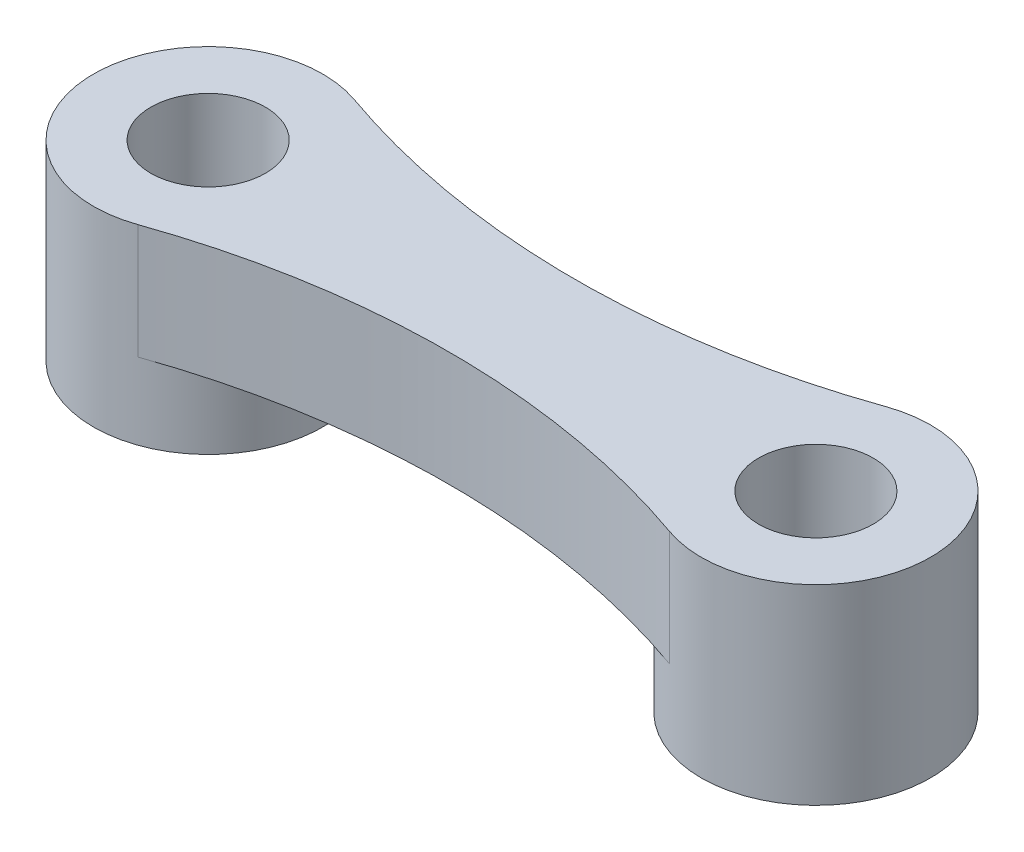
ISO-10303-21;
HEADER;
FILE_DESCRIPTION(('STEP AP214'),'2;1');
FILE_NAME('part.step','',(''),(''),'','','');
FILE_SCHEMA(('AUTOMOTIVE_DESIGN { 1 0 10303 214 1 1 1 1 }'));
ENDSEC;
DATA;
#1=APPLICATION_CONTEXT('core data for automotive mechanical design processes');
#2=APPLICATION_PROTOCOL_DEFINITION('international standard','automotive_design',2000,#1);
#3=PRODUCT_CONTEXT('',#1,'mechanical');
#4=PRODUCT('Part','Part','',(#3));
#5=PRODUCT_RELATED_PRODUCT_CATEGORY('part','',(#4));
#6=PRODUCT_DEFINITION_FORMATION('','',#4);
#7=PRODUCT_DEFINITION_CONTEXT('part definition',#1,'design');
#8=PRODUCT_DEFINITION('design','',#6,#7);
#9=PRODUCT_DEFINITION_SHAPE('','',#8);
#10=(LENGTH_UNIT() NAMED_UNIT(*) SI_UNIT(.MILLI.,.METRE.));
#11=(NAMED_UNIT(*) PLANE_ANGLE_UNIT() SI_UNIT($,.RADIAN.));
#12=(NAMED_UNIT(*) SI_UNIT($,.STERADIAN.) SOLID_ANGLE_UNIT());
#13=UNCERTAINTY_MEASURE_WITH_UNIT(LENGTH_MEASURE(1.E-05),#10,'distance_accuracy_value','');
#14=(GEOMETRIC_REPRESENTATION_CONTEXT(3) GLOBAL_UNCERTAINTY_ASSIGNED_CONTEXT((#13)) GLOBAL_UNIT_ASSIGNED_CONTEXT((#10,
#11,#12)) REPRESENTATION_CONTEXT('',''));
#15=CARTESIAN_POINT('',(0.,0.,0.));
#16=DIRECTION('',(0.,0.,1.));
#17=DIRECTION('',(1.,0.,0.));
#18=AXIS2_PLACEMENT_3D('',#15,#16,#17);
#19=CARTESIAN_POINT('',(-7.95,3.,0.));
#20=DIRECTION('',(0.,1.,0.));
#21=DIRECTION('',(0.,0.,1.));
#22=AXIS2_PLACEMENT_3D('',#19,#20,#21);
#23=PLANE('',#22);
#24=CARTESIAN_POINT('',(-7.95,3.,0.));
#25=DIRECTION('',(0.,1.,0.));
#26=DIRECTION('',(0.,0.,1.));
#27=AXIS2_PLACEMENT_3D('',#24,#25,#26);
#28=CIRCLE('',#27,1.5);
#29=CARTESIAN_POINT('',(-7.95,3.,1.5));
#30=VERTEX_POINT('',#29);
#31=EDGE_CURVE('E163',#30,#30,#28,.T.);
#32=ORIENTED_EDGE('',*,*,#31,.F.);
#33=EDGE_LOOP('',(#32));
#34=FACE_BOUND('',#33,.T.);
#35=CARTESIAN_POINT('',(7.95,3.,0.));
#36=DIRECTION('',(0.,1.,0.));
#37=DIRECTION('',(0.,0.,1.));
#38=AXIS2_PLACEMENT_3D('',#35,#36,#37);
#39=CIRCLE('',#38,1.5);
#40=CARTESIAN_POINT('',(7.95,3.,1.5));
#41=VERTEX_POINT('',#40);
#42=EDGE_CURVE('E158',#41,#41,#39,.T.);
#43=ORIENTED_EDGE('',*,*,#42,.F.);
#44=EDGE_LOOP('',(#43));
#45=FACE_BOUND('',#44,.T.);
#46=CARTESIAN_POINT('',(7.95,3.,0.));
#47=DIRECTION('',(0.,1.,0.));
#48=DIRECTION('',(0.,0.,1.));
#49=AXIS2_PLACEMENT_3D('',#46,#47,#48);
#50=CIRCLE('',#49,3.);
#51=CARTESIAN_POINT('',(6.95625,3.,2.83062907098404));
#52=VERTEX_POINT('',#51);
#53=CARTESIAN_POINT('',(6.95625000000001,3.,-2.83062907098404));
#54=VERTEX_POINT('',#53);
#55=EDGE_CURVE('E15',#52,#54,#50,.T.);
#56=ORIENTED_EDGE('',*,*,#55,.T.);
#57=CARTESIAN_POINT('',(0.,3.,-22.6450325678724));
#58=DIRECTION('',(0.,-1.,0.));
#59=DIRECTION('',(0.,0.,1.));
#60=AXIS2_PLACEMENT_3D('',#57,#58,#59);
#61=CIRCLE('',#60,21.);
#62=CARTESIAN_POINT('',(-6.95625,3.,-2.83062907098405));
#63=VERTEX_POINT('',#62);
#64=EDGE_CURVE('E153',#54,#63,#61,.T.);
#65=ORIENTED_EDGE('',*,*,#64,.T.);
#66=CARTESIAN_POINT('',(-7.95,3.,0.));
#67=DIRECTION('',(0.,1.,0.));
#68=DIRECTION('',(0.,0.,1.));
#69=AXIS2_PLACEMENT_3D('',#66,#67,#68);
#70=CIRCLE('',#69,3.);
#71=CARTESIAN_POINT('',(-6.95625,3.,2.83062907098405));
#72=VERTEX_POINT('',#71);
#73=EDGE_CURVE('E92',#63,#72,#70,.T.);
#74=ORIENTED_EDGE('',*,*,#73,.T.);
#75=CARTESIAN_POINT('',(0.,3.,22.6450325678724));
#76=DIRECTION('',(0.,-1.,0.));
#77=DIRECTION('',(0.,0.,-1.));
#78=AXIS2_PLACEMENT_3D('',#75,#76,#77);
#79=CIRCLE('',#78,21.);
#80=EDGE_CURVE('E149',#72,#52,#79,.T.);
#81=ORIENTED_EDGE('',*,*,#80,.T.);
#82=EDGE_LOOP('',(#56,#65,#74,#81));
#83=FACE_BOUND('',#82,.T.);
#84=ADVANCED_FACE('F84',(#34,#45,#83),#23,.T.);
#85=CARTESIAN_POINT('',(-7.95,0.,0.));
#86=DIRECTION('',(0.,1.,0.));
#87=DIRECTION('',(0.,0.,1.));
#88=AXIS2_PLACEMENT_3D('',#85,#86,#87);
#89=PLANE('',#88);
#90=CARTESIAN_POINT('',(0.,0.,-22.6450325678724));
#91=DIRECTION('',(0.,-1.,0.));
#92=DIRECTION('',(0.,0.,1.));
#93=AXIS2_PLACEMENT_3D('',#90,#91,#92);
#94=CIRCLE('',#93,21.);
#95=CARTESIAN_POINT('',(6.95625000000001,0.,-2.83062907098404));
#96=VERTEX_POINT('',#95);
#97=CARTESIAN_POINT('',(-6.95625,0.,-2.83062907098405));
#98=VERTEX_POINT('',#97);
#99=EDGE_CURVE('E128',#96,#98,#94,.T.);
#100=ORIENTED_EDGE('',*,*,#99,.F.);
#101=CARTESIAN_POINT('',(7.95,0.,0.));
#102=DIRECTION('',(0.,1.,0.));
#103=DIRECTION('',(0.,0.,1.));
#104=AXIS2_PLACEMENT_3D('',#101,#102,#103);
#105=CIRCLE('',#104,3.);
#106=CARTESIAN_POINT('',(6.95625,0.,2.83062907098405));
#107=VERTEX_POINT('',#106);
#108=EDGE_CURVE('E122',#96,#107,#105,.T.);
#109=ORIENTED_EDGE('',*,*,#108,.T.);
#110=CARTESIAN_POINT('',(0.,0.,22.6450325678724));
#111=DIRECTION('',(0.,-1.,0.));
#112=DIRECTION('',(0.,0.,-1.));
#113=AXIS2_PLACEMENT_3D('',#110,#111,#112);
#114=CIRCLE('',#113,21.);
#115=CARTESIAN_POINT('',(-6.95625,0.,2.83062907098405));
#116=VERTEX_POINT('',#115);
#117=EDGE_CURVE('E126',#116,#107,#114,.T.);
#118=ORIENTED_EDGE('',*,*,#117,.F.);
#119=CARTESIAN_POINT('',(-7.95,0.,0.));
#120=DIRECTION('',(0.,1.,0.));
#121=DIRECTION('',(0.,0.,1.));
#122=AXIS2_PLACEMENT_3D('',#119,#120,#121);
#123=CIRCLE('',#122,3.);
#124=EDGE_CURVE('E99',#116,#98,#123,.T.);
#125=ORIENTED_EDGE('',*,*,#124,.T.);
#126=EDGE_LOOP('',(#100,#109,#118,#125));
#127=FACE_BOUND('',#126,.T.);
#128=ADVANCED_FACE('F124',(#127),#89,.F.);
#129=CARTESIAN_POINT('',(-7.95,3.,0.));
#130=DIRECTION('',(0.,-1.,0.));
#131=DIRECTION('',(0.,0.,-1.));
#132=AXIS2_PLACEMENT_3D('',#129,#130,#131);
#133=CYLINDRICAL_SURFACE('',#132,3.);
#134=DIRECTION('',(0.,1.,0.));
#135=VECTOR('',#134,1.);
#136=CARTESIAN_POINT('',(-6.95625,0.,-2.83062907098405));
#137=LINE('',#136,#135);
#138=EDGE_CURVE('E146',#98,#63,#137,.T.);
#139=ORIENTED_EDGE('',*,*,#138,.F.);
#140=ORIENTED_EDGE('',*,*,#124,.F.);
#141=DIRECTION('',(0.,1.,0.));
#142=VECTOR('',#141,1.);
#143=CARTESIAN_POINT('',(-6.95625,0.,2.83062907098405));
#144=LINE('',#143,#142);
#145=EDGE_CURVE('E143',#116,#72,#144,.T.);
#146=ORIENTED_EDGE('',*,*,#145,.T.);
#147=ORIENTED_EDGE('',*,*,#73,.F.);
#148=EDGE_LOOP('',(#139,#140,#146,#147));
#149=FACE_BOUND('',#148,.T.);
#150=CARTESIAN_POINT('',(-7.95,-2.,0.));
#151=DIRECTION('',(0.,1.,0.));
#152=DIRECTION('',(0.,0.,1.));
#153=AXIS2_PLACEMENT_3D('',#150,#151,#152);
#154=CIRCLE('',#153,3.);
#155=CARTESIAN_POINT('',(-7.95,-2.,3.));
#156=VERTEX_POINT('',#155);
#157=EDGE_CURVE('E156',#156,#156,#154,.T.);
#158=ORIENTED_EDGE('',*,*,#157,.T.);
#159=EDGE_LOOP('',(#158));
#160=FACE_BOUND('',#159,.T.);
#161=ADVANCED_FACE('F86',(#149,#160),#133,.T.);
#162=CARTESIAN_POINT('',(7.95,3.,0.));
#163=DIRECTION('',(0.,-1.,0.));
#164=DIRECTION('',(0.,0.,-1.));
#165=AXIS2_PLACEMENT_3D('',#162,#163,#164);
#166=CYLINDRICAL_SURFACE('',#165,3.);
#167=DIRECTION('',(0.,1.,0.));
#168=VECTOR('',#167,1.);
#169=CARTESIAN_POINT('',(6.95625,0.,2.83062907098404));
#170=LINE('',#169,#168);
#171=EDGE_CURVE('E136',#107,#52,#170,.T.);
#172=ORIENTED_EDGE('',*,*,#171,.F.);
#173=ORIENTED_EDGE('',*,*,#108,.F.);
#174=DIRECTION('',(0.,1.,0.));
#175=VECTOR('',#174,1.);
#176=CARTESIAN_POINT('',(6.95625000000001,0.,-2.83062907098404));
#177=LINE('',#176,#175);
#178=EDGE_CURVE('E142',#96,#54,#177,.T.);
#179=ORIENTED_EDGE('',*,*,#178,.T.);
#180=ORIENTED_EDGE('',*,*,#55,.F.);
#181=EDGE_LOOP('',(#172,#173,#179,#180));
#182=FACE_BOUND('',#181,.T.);
#183=CARTESIAN_POINT('',(7.95,-2.,0.));
#184=DIRECTION('',(0.,1.,0.));
#185=DIRECTION('',(0.,0.,1.));
#186=AXIS2_PLACEMENT_3D('',#183,#184,#185);
#187=CIRCLE('',#186,3.);
#188=CARTESIAN_POINT('',(7.95,-2.,3.));
#189=VERTEX_POINT('',#188);
#190=EDGE_CURVE('E132',#189,#189,#187,.T.);
#191=ORIENTED_EDGE('',*,*,#190,.T.);
#192=EDGE_LOOP('',(#191));
#193=FACE_BOUND('',#192,.T.);
#194=ADVANCED_FACE('F137',(#182,#193),#166,.T.);
#195=CARTESIAN_POINT('',(-7.95,3.,0.));
#196=DIRECTION('',(0.,-1.,0.));
#197=DIRECTION('',(0.,0.,-1.));
#198=AXIS2_PLACEMENT_3D('',#195,#196,#197);
#199=CYLINDRICAL_SURFACE('',#198,1.5);
#200=ORIENTED_EDGE('',*,*,#31,.T.);
#201=EDGE_LOOP('',(#200));
#202=FACE_BOUND('',#201,.T.);
#203=CARTESIAN_POINT('',(-7.95,-2.,0.));
#204=DIRECTION('',(0.,1.,0.));
#205=DIRECTION('',(0.,0.,1.));
#206=AXIS2_PLACEMENT_3D('',#203,#204,#205);
#207=CIRCLE('',#206,1.5);
#208=CARTESIAN_POINT('',(-7.95,-2.,1.5));
#209=VERTEX_POINT('',#208);
#210=EDGE_CURVE('E173',#209,#209,#207,.T.);
#211=ORIENTED_EDGE('',*,*,#210,.F.);
#212=EDGE_LOOP('',(#211));
#213=FACE_BOUND('',#212,.T.);
#214=ADVANCED_FACE('F188',(#202,#213),#199,.F.);
#215=CARTESIAN_POINT('',(7.95,3.,0.));
#216=DIRECTION('',(0.,-1.,0.));
#217=DIRECTION('',(0.,0.,-1.));
#218=AXIS2_PLACEMENT_3D('',#215,#216,#217);
#219=CYLINDRICAL_SURFACE('',#218,1.5);
#220=ORIENTED_EDGE('',*,*,#42,.T.);
#221=EDGE_LOOP('',(#220));
#222=FACE_BOUND('',#221,.T.);
#223=CARTESIAN_POINT('',(7.95,-2.,0.));
#224=DIRECTION('',(0.,1.,0.));
#225=DIRECTION('',(0.,0.,1.));
#226=AXIS2_PLACEMENT_3D('',#223,#224,#225);
#227=CIRCLE('',#226,1.5);
#228=CARTESIAN_POINT('',(7.95,-2.,1.5));
#229=VERTEX_POINT('',#228);
#230=EDGE_CURVE('E133',#229,#229,#227,.T.);
#231=ORIENTED_EDGE('',*,*,#230,.F.);
#232=EDGE_LOOP('',(#231));
#233=FACE_BOUND('',#232,.T.);
#234=ADVANCED_FACE('F185',(#222,#233),#219,.F.);
#235=CARTESIAN_POINT('',(0.,0.,-22.6450325678724));
#236=DIRECTION('',(0.,1.,0.));
#237=DIRECTION('',(0.,0.,1.));
#238=AXIS2_PLACEMENT_3D('',#235,#236,#237);
#239=CYLINDRICAL_SURFACE('',#238,21.);
#240=ORIENTED_EDGE('',*,*,#64,.F.);
#241=ORIENTED_EDGE('',*,*,#178,.F.);
#242=ORIENTED_EDGE('',*,*,#99,.T.);
#243=ORIENTED_EDGE('',*,*,#138,.T.);
#244=EDGE_LOOP('',(#240,#241,#242,#243));
#245=FACE_BOUND('',#244,.T.);
#246=ADVANCED_FACE('F187',(#245),#239,.F.);
#247=CARTESIAN_POINT('',(0.,0.,22.6450325678724));
#248=DIRECTION('',(0.,1.,0.));
#249=DIRECTION('',(0.,0.,1.));
#250=AXIS2_PLACEMENT_3D('',#247,#248,#249);
#251=CYLINDRICAL_SURFACE('',#250,21.);
#252=ORIENTED_EDGE('',*,*,#80,.F.);
#253=ORIENTED_EDGE('',*,*,#145,.F.);
#254=ORIENTED_EDGE('',*,*,#117,.T.);
#255=ORIENTED_EDGE('',*,*,#171,.T.);
#256=EDGE_LOOP('',(#252,#253,#254,#255));
#257=FACE_BOUND('',#256,.T.);
#258=ADVANCED_FACE('F145',(#257),#251,.F.);
#259=CARTESIAN_POINT('',(-7.95,-2.,0.));
#260=DIRECTION('',(0.,1.,0.));
#261=DIRECTION('',(0.,0.,1.));
#262=AXIS2_PLACEMENT_3D('',#259,#260,#261);
#263=PLANE('',#262);
#264=ORIENTED_EDGE('',*,*,#210,.T.);
#265=EDGE_LOOP('',(#264));
#266=FACE_BOUND('',#265,.T.);
#267=ORIENTED_EDGE('',*,*,#157,.F.);
#268=EDGE_LOOP('',(#267));
#269=FACE_BOUND('',#268,.T.);
#270=ADVANCED_FACE('F240',(#266,#269),#263,.F.);
#271=CARTESIAN_POINT('',(7.95,-2.,0.));
#272=DIRECTION('',(0.,1.,0.));
#273=DIRECTION('',(0.,0.,1.));
#274=AXIS2_PLACEMENT_3D('',#271,#272,#273);
#275=PLANE('',#274);
#276=ORIENTED_EDGE('',*,*,#230,.T.);
#277=EDGE_LOOP('',(#276));
#278=FACE_BOUND('',#277,.T.);
#279=ORIENTED_EDGE('',*,*,#190,.F.);
#280=EDGE_LOOP('',(#279));
#281=FACE_BOUND('',#280,.T.);
#282=ADVANCED_FACE('F182',(#278,#281),#275,.F.);
#283=CLOSED_SHELL('',(#84,#128,#161,#194,#214,#234,#246,#258,#270,#282));
#284=MANIFOLD_SOLID_BREP('B2',#283);
#285=ADVANCED_BREP_SHAPE_REPRESENTATION('',(#18,#284),#14);
#286=SHAPE_DEFINITION_REPRESENTATION(#9,#285);
ENDSEC;
END-ISO-10303-21;
